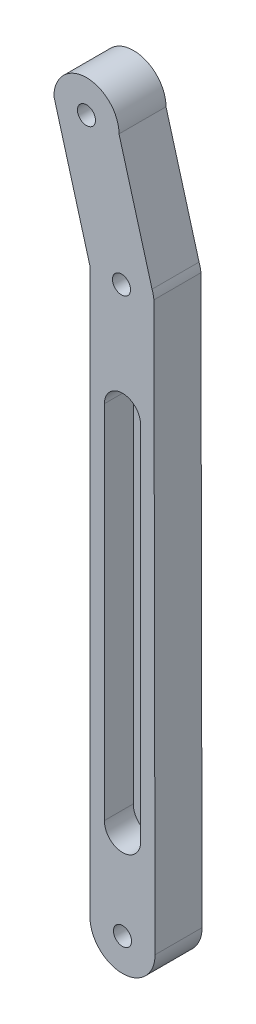
ISO-10303-21;
HEADER;
FILE_DESCRIPTION(('STEP AP214'),'2;1');
FILE_NAME('part.step','',(''),(''),'','','');
FILE_SCHEMA(('AUTOMOTIVE_DESIGN { 1 0 10303 214 1 1 1 1 }'));
ENDSEC;
DATA;
#1=APPLICATION_CONTEXT('core data for automotive mechanical design processes');
#2=APPLICATION_PROTOCOL_DEFINITION('international standard','automotive_design',2000,#1);
#3=PRODUCT_CONTEXT('',#1,'mechanical');
#4=PRODUCT('Part','Part','',(#3));
#5=PRODUCT_RELATED_PRODUCT_CATEGORY('part','',(#4));
#6=PRODUCT_DEFINITION_FORMATION('','',#4);
#7=PRODUCT_DEFINITION_CONTEXT('part definition',#1,'design');
#8=PRODUCT_DEFINITION('design','',#6,#7);
#9=PRODUCT_DEFINITION_SHAPE('','',#8);
#10=(LENGTH_UNIT() NAMED_UNIT(*) SI_UNIT(.MILLI.,.METRE.));
#11=(NAMED_UNIT(*) PLANE_ANGLE_UNIT() SI_UNIT($,.RADIAN.));
#12=(NAMED_UNIT(*) SI_UNIT($,.STERADIAN.) SOLID_ANGLE_UNIT());
#13=UNCERTAINTY_MEASURE_WITH_UNIT(LENGTH_MEASURE(1.E-05),#10,'distance_accuracy_value','');
#14=(GEOMETRIC_REPRESENTATION_CONTEXT(3) GLOBAL_UNCERTAINTY_ASSIGNED_CONTEXT((#13)) GLOBAL_UNIT_ASSIGNED_CONTEXT((#10,
#11,#12)) REPRESENTATION_CONTEXT('',''));
#15=CARTESIAN_POINT('',(0.,0.,0.));
#16=DIRECTION('',(0.,0.,1.));
#17=DIRECTION('',(1.,0.,0.));
#18=AXIS2_PLACEMENT_3D('',#15,#16,#17);
#19=CARTESIAN_POINT('',(-12.0849340363572,148.987312466072,13.));
#20=DIRECTION('',(0.,0.,1.));
#21=DIRECTION('',(1.,0.,0.));
#22=AXIS2_PLACEMENT_3D('',#19,#20,#21);
#23=PLANE('',#22);
#24=CARTESIAN_POINT('',(-2.11461561853498,82.3636914419414,13.));
#25=DIRECTION('',(0.,0.,1.));
#26=DIRECTION('',(1.,0.,0.));
#27=AXIS2_PLACEMENT_3D('',#24,#25,#26);
#28=CIRCLE('',#27,5.);
#29=CARTESIAN_POINT('',(2.88538438146502,82.3636914419414,13.));
#30=VERTEX_POINT('',#29);
#31=CARTESIAN_POINT('',(-7.11461561853498,82.3636914419414,13.));
#32=VERTEX_POINT('',#31);
#33=EDGE_CURVE('E54',#30,#32,#28,.T.);
#34=ORIENTED_EDGE('',*,*,#33,.F.);
#35=DIRECTION('',(0.000571960577738296,0.999999836430535,0.));
#36=VECTOR('',#35,1.);
#37=CARTESIAN_POINT('',(2.88538438146502,82.3636914419414,13.));
#38=LINE('',#37,#36);
#39=CARTESIAN_POINT('',(2.82861802437657,-16.8850155715431,13.));
#40=VERTEX_POINT('',#39);
#41=EDGE_CURVE('E208',#40,#30,#38,.T.);
#42=ORIENTED_EDGE('',*,*,#41,.F.);
#43=CARTESIAN_POINT('',(-2.11461561853498,-17.6363085580586,13.));
#44=DIRECTION('',(0.,0.,1.));
#45=DIRECTION('',(1.,0.,0.));
#46=AXIS2_PLACEMENT_3D('',#43,#44,#45);
#47=CIRCLE('',#46,5.);
#48=CARTESIAN_POINT('',(-7.11208071176572,-17.4771148334957,13.));
#49=VERTEX_POINT('',#48);
#50=EDGE_CURVE('E212',#49,#40,#47,.T.);
#51=ORIENTED_EDGE('',*,*,#50,.F.);
#52=DIRECTION('',(2.53894861530553E-05,-0.999999999677687,0.));
#53=VECTOR('',#52,1.);
#54=CARTESIAN_POINT('',(-7.11461561853498,82.3636914419414,13.));
#55=LINE('',#54,#53);
#56=EDGE_CURVE('E215',#32,#49,#55,.T.);
#57=ORIENTED_EDGE('',*,*,#56,.F.);
#58=EDGE_LOOP('',(#34,#42,#51,#57));
#59=FACE_BOUND('',#58,.T.);
#60=CARTESIAN_POINT('',(-2.11461561853496,-42.6363085580586,13.));
#61=DIRECTION('',(0.,0.,1.));
#62=DIRECTION('',(1.,0.,0.));
#63=AXIS2_PLACEMENT_3D('',#60,#61,#62);
#64=CIRCLE('',#63,2.5);
#65=CARTESIAN_POINT('',(-4.61461561853496,-42.6363085580586,13.));
#66=VERTEX_POINT('',#65);
#67=EDGE_CURVE('E183',#66,#66,#64,.T.);
#68=ORIENTED_EDGE('',*,*,#67,.F.);
#69=EDGE_LOOP('',(#68));
#70=FACE_BOUND('',#69,.T.);
#71=DIRECTION('',(0.268918327495868,-0.963162983682837,0.));
#72=VECTOR('',#71,1.);
#73=CARTESIAN_POINT('',(-11.114615618535,113.277430863729,13.));
#74=LINE('',#73,#72);
#75=CARTESIAN_POINT('',(-21.0849340363572,148.987312466072,13.));
#76=VERTEX_POINT('',#75);
#77=CARTESIAN_POINT('',(-11.114615618535,113.277430863729,13.));
#78=VERTEX_POINT('',#77);
#79=EDGE_CURVE('E156',#76,#78,#74,.T.);
#80=ORIENTED_EDGE('',*,*,#79,.T.);
#81=DIRECTION('',(0.,-1.,0.));
#82=VECTOR('',#81,1.);
#83=CARTESIAN_POINT('',(-11.114615618535,113.277430863729,13.));
#84=LINE('',#83,#82);
#85=CARTESIAN_POINT('',(-11.114615618535,-42.6363085580586,13.));
#86=VERTEX_POINT('',#85);
#87=EDGE_CURVE('E101',#78,#86,#84,.T.);
#88=ORIENTED_EDGE('',*,*,#87,.T.);
#89=CARTESIAN_POINT('',(-2.11461561853496,-42.6363085580586,13.));
#90=DIRECTION('',(0.,0.,1.));
#91=DIRECTION('',(1.,0.,0.));
#92=AXIS2_PLACEMENT_3D('',#89,#90,#91);
#93=CIRCLE('',#92,9.);
#94=CARTESIAN_POINT('',(6.88538438146504,-42.6363085580586,13.));
#95=VERTEX_POINT('',#94);
#96=EDGE_CURVE('E168',#86,#95,#93,.T.);
#97=ORIENTED_EDGE('',*,*,#96,.T.);
#98=DIRECTION('',(-0.00204369502849195,0.999997911653135,0.));
#99=VECTOR('',#98,1.);
#100=CARTESIAN_POINT('',(6.88538438146504,-42.6363085580586,13.));
#101=LINE('',#100,#99);
#102=CARTESIAN_POINT('',(6.56511811579736,114.072785693132,13.));
#103=VERTEX_POINT('',#102);
#104=EDGE_CURVE('E121',#95,#103,#101,.T.);
#105=ORIENTED_EDGE('',*,*,#104,.T.);
#106=CARTESIAN_POINT('',(-2.39966914856901,113.277430863729,13.));
#107=DIRECTION('',(0.,0.,1.));
#108=DIRECTION('',(1.,0.,0.));
#109=AXIS2_PLACEMENT_3D('',#106,#107,#108);
#110=CIRCLE('',#109,9.);
#111=CARTESIAN_POINT('',(6.05371091603838,116.366179070252,13.));
#112=VERTEX_POINT('',#111);
#113=EDGE_CURVE('E114',#103,#112,#110,.T.);
#114=ORIENTED_EDGE('',*,*,#113,.T.);
#115=DIRECTION('',(-0.269759329456065,0.962927777235351,0.));
#116=VECTOR('',#115,1.);
#117=CARTESIAN_POINT('',(6.05371091603838,116.366179070252,13.));
#118=LINE('',#117,#116);
#119=CARTESIAN_POINT('',(-3.08493403635723,148.987312466072,13.));
#120=VERTEX_POINT('',#119);
#121=EDGE_CURVE('E118',#112,#120,#118,.T.);
#122=ORIENTED_EDGE('',*,*,#121,.T.);
#123=CARTESIAN_POINT('',(-12.0849340363572,148.987312466072,13.));
#124=DIRECTION('',(0.,0.,1.));
#125=DIRECTION('',(1.,0.,0.));
#126=AXIS2_PLACEMENT_3D('',#123,#124,#125);
#127=CIRCLE('',#126,9.);
#128=EDGE_CURVE('E63',#120,#76,#127,.T.);
#129=ORIENTED_EDGE('',*,*,#128,.T.);
#130=EDGE_LOOP('',(#80,#88,#97,#105,#114,#122,#129));
#131=FACE_BOUND('',#130,.T.);
#132=CARTESIAN_POINT('',(-2.39966914856901,113.277430863729,13.));
#133=DIRECTION('',(0.,0.,1.));
#134=DIRECTION('',(1.,0.,0.));
#135=AXIS2_PLACEMENT_3D('',#132,#133,#134);
#136=CIRCLE('',#135,2.5);
#137=CARTESIAN_POINT('',(-4.89966914856901,113.277430863729,13.));
#138=VERTEX_POINT('',#137);
#139=EDGE_CURVE('E146',#138,#138,#136,.T.);
#140=ORIENTED_EDGE('',*,*,#139,.F.);
#141=EDGE_LOOP('',(#140));
#142=FACE_BOUND('',#141,.T.);
#143=CARTESIAN_POINT('',(-12.0849340363572,148.987312466072,13.));
#144=DIRECTION('',(0.,0.,1.));
#145=DIRECTION('',(1.,0.,0.));
#146=AXIS2_PLACEMENT_3D('',#143,#144,#145);
#147=CIRCLE('',#146,2.5);
#148=CARTESIAN_POINT('',(-14.5849340363572,148.987312466072,13.));
#149=VERTEX_POINT('',#148);
#150=EDGE_CURVE('E189',#149,#149,#147,.T.);
#151=ORIENTED_EDGE('',*,*,#150,.F.);
#152=EDGE_LOOP('',(#151));
#153=FACE_BOUND('',#152,.T.);
#154=ADVANCED_FACE('F39',(#59,#70,#131,#142,#153),#23,.T.);
#155=CARTESIAN_POINT('',(-12.0849340363572,148.987312466072,0.));
#156=DIRECTION('',(0.,0.,1.));
#157=DIRECTION('',(1.,0.,0.));
#158=AXIS2_PLACEMENT_3D('',#155,#156,#157);
#159=PLANE('',#158);
#160=CARTESIAN_POINT('',(-2.11461561853496,-42.6363085580586,0.));
#161=DIRECTION('',(0.,0.,1.));
#162=DIRECTION('',(1.,0.,0.));
#163=AXIS2_PLACEMENT_3D('',#160,#161,#162);
#164=CIRCLE('',#163,2.5);
#165=CARTESIAN_POINT('',(-4.61461561853496,-42.6363085580586,0.));
#166=VERTEX_POINT('',#165);
#167=EDGE_CURVE('E186',#166,#166,#164,.T.);
#168=ORIENTED_EDGE('',*,*,#167,.T.);
#169=EDGE_LOOP('',(#168));
#170=FACE_BOUND('',#169,.T.);
#171=DIRECTION('',(0.268918327495868,-0.963162983682837,0.));
#172=VECTOR('',#171,1.);
#173=CARTESIAN_POINT('',(-11.114615618535,113.277430863729,0.));
#174=LINE('',#173,#172);
#175=CARTESIAN_POINT('',(-21.0849340363572,148.987312466072,0.));
#176=VERTEX_POINT('',#175);
#177=CARTESIAN_POINT('',(-11.114615618535,113.277430863729,0.));
#178=VERTEX_POINT('',#177);
#179=EDGE_CURVE('E142',#176,#178,#174,.T.);
#180=ORIENTED_EDGE('',*,*,#179,.F.);
#181=CARTESIAN_POINT('',(-12.0849340363572,148.987312466072,0.));
#182=DIRECTION('',(0.,0.,1.));
#183=DIRECTION('',(1.,0.,0.));
#184=AXIS2_PLACEMENT_3D('',#181,#182,#183);
#185=CIRCLE('',#184,9.);
#186=CARTESIAN_POINT('',(-3.08493403635723,148.987312466072,0.));
#187=VERTEX_POINT('',#186);
#188=EDGE_CURVE('E93',#187,#176,#185,.T.);
#189=ORIENTED_EDGE('',*,*,#188,.F.);
#190=DIRECTION('',(-0.269759329456065,0.962927777235351,0.));
#191=VECTOR('',#190,1.);
#192=CARTESIAN_POINT('',(6.05371091603838,116.366179070252,0.));
#193=LINE('',#192,#191);
#194=CARTESIAN_POINT('',(6.05371091603838,116.366179070252,0.));
#195=VERTEX_POINT('',#194);
#196=EDGE_CURVE('E153',#195,#187,#193,.T.);
#197=ORIENTED_EDGE('',*,*,#196,.F.);
#198=CARTESIAN_POINT('',(-2.39966914856901,113.277430863729,0.));
#199=DIRECTION('',(0.,0.,1.));
#200=DIRECTION('',(1.,0.,0.));
#201=AXIS2_PLACEMENT_3D('',#198,#199,#200);
#202=CIRCLE('',#201,9.);
#203=CARTESIAN_POINT('',(6.56511811579736,114.072785693132,0.));
#204=VERTEX_POINT('',#203);
#205=EDGE_CURVE('E130',#204,#195,#202,.T.);
#206=ORIENTED_EDGE('',*,*,#205,.F.);
#207=DIRECTION('',(-0.00204369502849195,0.999997911653135,0.));
#208=VECTOR('',#207,1.);
#209=CARTESIAN_POINT('',(6.88538438146504,-42.6363085580586,0.));
#210=LINE('',#209,#208);
#211=CARTESIAN_POINT('',(6.88538438146504,-42.6363085580586,0.));
#212=VERTEX_POINT('',#211);
#213=EDGE_CURVE('E150',#212,#204,#210,.T.);
#214=ORIENTED_EDGE('',*,*,#213,.F.);
#215=CARTESIAN_POINT('',(-2.11461561853496,-42.6363085580586,0.));
#216=DIRECTION('',(0.,0.,1.));
#217=DIRECTION('',(1.,0.,0.));
#218=AXIS2_PLACEMENT_3D('',#215,#216,#217);
#219=CIRCLE('',#218,9.);
#220=CARTESIAN_POINT('',(-11.114615618535,-42.6363085580586,0.));
#221=VERTEX_POINT('',#220);
#222=EDGE_CURVE('E148',#221,#212,#219,.T.);
#223=ORIENTED_EDGE('',*,*,#222,.F.);
#224=DIRECTION('',(0.,-1.,0.));
#225=VECTOR('',#224,1.);
#226=CARTESIAN_POINT('',(-11.114615618535,113.277430863729,0.));
#227=LINE('',#226,#225);
#228=EDGE_CURVE('E145',#178,#221,#227,.T.);
#229=ORIENTED_EDGE('',*,*,#228,.F.);
#230=EDGE_LOOP('',(#180,#189,#197,#206,#214,#223,#229));
#231=FACE_BOUND('',#230,.T.);
#232=CARTESIAN_POINT('',(-2.39966914856901,113.277430863729,0.));
#233=DIRECTION('',(0.,0.,1.));
#234=DIRECTION('',(1.,0.,0.));
#235=AXIS2_PLACEMENT_3D('',#232,#233,#234);
#236=CIRCLE('',#235,2.5);
#237=CARTESIAN_POINT('',(-4.89966914856901,113.277430863729,0.));
#238=VERTEX_POINT('',#237);
#239=EDGE_CURVE('E180',#238,#238,#236,.T.);
#240=ORIENTED_EDGE('',*,*,#239,.T.);
#241=EDGE_LOOP('',(#240));
#242=FACE_BOUND('',#241,.T.);
#243=CARTESIAN_POINT('',(-12.0849340363572,148.987312466072,0.));
#244=DIRECTION('',(0.,0.,1.));
#245=DIRECTION('',(1.,0.,0.));
#246=AXIS2_PLACEMENT_3D('',#243,#244,#245);
#247=CIRCLE('',#246,2.5);
#248=CARTESIAN_POINT('',(-14.5849340363572,148.987312466072,0.));
#249=VERTEX_POINT('',#248);
#250=EDGE_CURVE('E192',#249,#249,#247,.T.);
#251=ORIENTED_EDGE('',*,*,#250,.T.);
#252=EDGE_LOOP('',(#251));
#253=FACE_BOUND('',#252,.T.);
#254=ADVANCED_FACE('F172',(#170,#231,#242,#253),#159,.F.);
#255=CARTESIAN_POINT('',(-11.114615618535,113.277430863729,13.));
#256=DIRECTION('',(0.963162983682837,0.268918327495868,0.));
#257=DIRECTION('',(-0.268918327495868,0.963162983682837,0.));
#258=AXIS2_PLACEMENT_3D('',#255,#256,#257);
#259=PLANE('',#258);
#260=ORIENTED_EDGE('',*,*,#179,.T.);
#261=DIRECTION('',(0.,0.,-1.));
#262=VECTOR('',#261,1.);
#263=CARTESIAN_POINT('',(-11.114615618535,113.277430863729,13.));
#264=LINE('',#263,#262);
#265=EDGE_CURVE('E11',#78,#178,#264,.T.);
#266=ORIENTED_EDGE('',*,*,#265,.F.);
#267=ORIENTED_EDGE('',*,*,#79,.F.);
#268=DIRECTION('',(0.,0.,-1.));
#269=VECTOR('',#268,1.);
#270=CARTESIAN_POINT('',(-21.0849340363572,148.987312466072,13.));
#271=LINE('',#270,#269);
#272=EDGE_CURVE('E138',#76,#176,#271,.T.);
#273=ORIENTED_EDGE('',*,*,#272,.T.);
#274=EDGE_LOOP('',(#260,#266,#267,#273));
#275=FACE_BOUND('',#274,.T.);
#276=ADVANCED_FACE('F41',(#275),#259,.F.);
#277=CARTESIAN_POINT('',(-11.114615618535,113.277430863729,13.));
#278=DIRECTION('',(1.,0.,0.));
#279=DIRECTION('',(0.,1.,0.));
#280=AXIS2_PLACEMENT_3D('',#277,#278,#279);
#281=PLANE('',#280);
#282=ORIENTED_EDGE('',*,*,#228,.T.);
#283=DIRECTION('',(0.,0.,-1.));
#284=VECTOR('',#283,1.);
#285=CARTESIAN_POINT('',(-11.114615618535,-42.6363085580586,13.));
#286=LINE('',#285,#284);
#287=EDGE_CURVE('E47',#86,#221,#286,.T.);
#288=ORIENTED_EDGE('',*,*,#287,.F.);
#289=ORIENTED_EDGE('',*,*,#87,.F.);
#290=ORIENTED_EDGE('',*,*,#265,.T.);
#291=EDGE_LOOP('',(#282,#288,#289,#290));
#292=FACE_BOUND('',#291,.T.);
#293=ADVANCED_FACE('F291',(#292),#281,.F.);
#294=CARTESIAN_POINT('',(-2.11461561853496,-42.6363085580586,13.));
#295=DIRECTION('',(0.,0.,-1.));
#296=DIRECTION('',(-1.,0.,0.));
#297=AXIS2_PLACEMENT_3D('',#294,#295,#296);
#298=CYLINDRICAL_SURFACE('',#297,9.);
#299=ORIENTED_EDGE('',*,*,#222,.T.);
#300=DIRECTION('',(0.,0.,-1.));
#301=VECTOR('',#300,1.);
#302=CARTESIAN_POINT('',(6.88538438146504,-42.6363085580586,13.));
#303=LINE('',#302,#301);
#304=EDGE_CURVE('E160',#95,#212,#303,.T.);
#305=ORIENTED_EDGE('',*,*,#304,.F.);
#306=ORIENTED_EDGE('',*,*,#96,.F.);
#307=ORIENTED_EDGE('',*,*,#287,.T.);
#308=EDGE_LOOP('',(#299,#305,#306,#307));
#309=FACE_BOUND('',#308,.T.);
#310=ADVANCED_FACE('F166',(#309),#298,.T.);
#311=CARTESIAN_POINT('',(6.88538438146504,-42.6363085580586,13.));
#312=DIRECTION('',(-0.999997911653135,-0.00204369502849195,0.));
#313=DIRECTION('',(0.00204369502849195,-0.999997911653135,0.));
#314=AXIS2_PLACEMENT_3D('',#311,#312,#313);
#315=PLANE('',#314);
#316=ORIENTED_EDGE('',*,*,#213,.T.);
#317=DIRECTION('',(0.,0.,-1.));
#318=VECTOR('',#317,1.);
#319=CARTESIAN_POINT('',(6.56511811579736,114.072785693132,13.));
#320=LINE('',#319,#318);
#321=EDGE_CURVE('E133',#103,#204,#320,.T.);
#322=ORIENTED_EDGE('',*,*,#321,.F.);
#323=ORIENTED_EDGE('',*,*,#104,.F.);
#324=ORIENTED_EDGE('',*,*,#304,.T.);
#325=EDGE_LOOP('',(#316,#322,#323,#324));
#326=FACE_BOUND('',#325,.T.);
#327=ADVANCED_FACE('F175',(#326),#315,.F.);
#328=CARTESIAN_POINT('',(-2.39966914856901,113.277430863729,13.));
#329=DIRECTION('',(0.,0.,-1.));
#330=DIRECTION('',(-1.,0.,0.));
#331=AXIS2_PLACEMENT_3D('',#328,#329,#330);
#332=CYLINDRICAL_SURFACE('',#331,9.);
#333=ORIENTED_EDGE('',*,*,#205,.T.);
#334=DIRECTION('',(0.,0.,-1.));
#335=VECTOR('',#334,1.);
#336=CARTESIAN_POINT('',(6.05371091603838,116.366179070252,13.));
#337=LINE('',#336,#335);
#338=EDGE_CURVE('E127',#112,#195,#337,.T.);
#339=ORIENTED_EDGE('',*,*,#338,.F.);
#340=ORIENTED_EDGE('',*,*,#113,.F.);
#341=ORIENTED_EDGE('',*,*,#321,.T.);
#342=EDGE_LOOP('',(#333,#339,#340,#341));
#343=FACE_BOUND('',#342,.T.);
#344=ADVANCED_FACE('F128',(#343),#332,.T.);
#345=CARTESIAN_POINT('',(6.05371091603838,116.366179070252,13.));
#346=DIRECTION('',(-0.962927777235351,-0.269759329456065,0.));
#347=DIRECTION('',(0.269759329456065,-0.962927777235351,0.));
#348=AXIS2_PLACEMENT_3D('',#345,#346,#347);
#349=PLANE('',#348);
#350=ORIENTED_EDGE('',*,*,#196,.T.);
#351=DIRECTION('',(0.,0.,-1.));
#352=VECTOR('',#351,1.);
#353=CARTESIAN_POINT('',(-3.08493403635723,148.987312466072,13.));
#354=LINE('',#353,#352);
#355=EDGE_CURVE('E134',#120,#187,#354,.T.);
#356=ORIENTED_EDGE('',*,*,#355,.F.);
#357=ORIENTED_EDGE('',*,*,#121,.F.);
#358=ORIENTED_EDGE('',*,*,#338,.T.);
#359=EDGE_LOOP('',(#350,#356,#357,#358));
#360=FACE_BOUND('',#359,.T.);
#361=ADVANCED_FACE('F136',(#360),#349,.F.);
#362=CARTESIAN_POINT('',(-12.0849340363572,148.987312466072,13.));
#363=DIRECTION('',(0.,0.,-1.));
#364=DIRECTION('',(-1.,0.,0.));
#365=AXIS2_PLACEMENT_3D('',#362,#363,#364);
#366=CYLINDRICAL_SURFACE('',#365,9.);
#367=ORIENTED_EDGE('',*,*,#188,.T.);
#368=ORIENTED_EDGE('',*,*,#272,.F.);
#369=ORIENTED_EDGE('',*,*,#128,.F.);
#370=ORIENTED_EDGE('',*,*,#355,.T.);
#371=EDGE_LOOP('',(#367,#368,#369,#370));
#372=FACE_BOUND('',#371,.T.);
#373=ADVANCED_FACE('F281',(#372),#366,.T.);
#374=CARTESIAN_POINT('',(-2.39966914856901,113.277430863729,13.));
#375=DIRECTION('',(0.,0.,-1.));
#376=DIRECTION('',(-1.,0.,0.));
#377=AXIS2_PLACEMENT_3D('',#374,#375,#376);
#378=CYLINDRICAL_SURFACE('',#377,2.5);
#379=CARTESIAN_POINT('',(-4.89966914856901,113.277430863729,13.));
#380=CARTESIAN_POINT('',(-4.89966914856901,113.277430863729,12.8645833333333));
#381=CARTESIAN_POINT('',(-4.89966914856901,113.277430863729,12.7291666666667));
#382=CARTESIAN_POINT('',(-4.89966914856901,113.277430863729,12.4583333333333));
#383=CARTESIAN_POINT('',(-4.89966914856901,113.277430863729,12.3229166666667));
#384=CARTESIAN_POINT('',(-4.89966914856901,113.277430863729,12.0520833333333));
#385=CARTESIAN_POINT('',(-4.89966914856901,113.277430863729,11.9166666666667));
#386=CARTESIAN_POINT('',(-4.89966914856901,113.277430863729,11.6458333333333));
#387=CARTESIAN_POINT('',(-4.89966914856901,113.277430863729,11.5104166666667));
#388=CARTESIAN_POINT('',(-4.89966914856901,113.277430863729,11.2395833333333));
#389=CARTESIAN_POINT('',(-4.89966914856901,113.277430863729,11.1041666666667));
#390=CARTESIAN_POINT('',(-4.89966914856901,113.277430863729,10.8333333333333));
#391=CARTESIAN_POINT('',(-4.89966914856901,113.277430863729,10.6979166666667));
#392=CARTESIAN_POINT('',(-4.89966914856901,113.277430863729,10.4270833333333));
#393=CARTESIAN_POINT('',(-4.89966914856901,113.277430863729,10.2916666666667));
#394=CARTESIAN_POINT('',(-4.89966914856901,113.277430863729,10.0208333333333));
#395=CARTESIAN_POINT('',(-4.89966914856901,113.277430863729,9.88541666666667));
#396=CARTESIAN_POINT('',(-4.89966914856901,113.277430863729,9.61458333333333));
#397=CARTESIAN_POINT('',(-4.89966914856901,113.277430863729,9.47916666666667));
#398=CARTESIAN_POINT('',(-4.89966914856901,113.277430863729,9.20833333333333));
#399=CARTESIAN_POINT('',(-4.89966914856901,113.277430863729,9.07291666666667));
#400=CARTESIAN_POINT('',(-4.89966914856901,113.277430863729,8.80208333333333));
#401=CARTESIAN_POINT('',(-4.89966914856901,113.277430863729,8.66666666666667));
#402=CARTESIAN_POINT('',(-4.89966914856901,113.277430863729,8.39583333333333));
#403=CARTESIAN_POINT('',(-4.89966914856901,113.277430863729,8.26041666666667));
#404=CARTESIAN_POINT('',(-4.89966914856901,113.277430863729,7.98958333333333));
#405=CARTESIAN_POINT('',(-4.89966914856901,113.277430863729,7.85416666666667));
#406=CARTESIAN_POINT('',(-4.89966914856901,113.277430863729,7.58333333333333));
#407=CARTESIAN_POINT('',(-4.89966914856901,113.277430863729,7.44791666666667));
#408=CARTESIAN_POINT('',(-4.89966914856901,113.277430863729,7.17708333333333));
#409=CARTESIAN_POINT('',(-4.89966914856901,113.277430863729,7.04166666666667));
#410=CARTESIAN_POINT('',(-4.89966914856901,113.277430863729,6.77083333333333));
#411=CARTESIAN_POINT('',(-4.89966914856901,113.277430863729,6.63541666666667));
#412=CARTESIAN_POINT('',(-4.89966914856901,113.277430863729,6.36458333333333));
#413=CARTESIAN_POINT('',(-4.89966914856901,113.277430863729,6.22916666666667));
#414=CARTESIAN_POINT('',(-4.89966914856901,113.277430863729,5.95833333333333));
#415=CARTESIAN_POINT('',(-4.89966914856901,113.277430863729,5.82291666666667));
#416=CARTESIAN_POINT('',(-4.89966914856901,113.277430863729,5.55208333333333));
#417=CARTESIAN_POINT('',(-4.89966914856901,113.277430863729,5.41666666666667));
#418=CARTESIAN_POINT('',(-4.89966914856901,113.277430863729,5.14583333333333));
#419=CARTESIAN_POINT('',(-4.89966914856901,113.277430863729,5.01041666666667));
#420=CARTESIAN_POINT('',(-4.89966914856901,113.277430863729,4.73958333333333));
#421=CARTESIAN_POINT('',(-4.89966914856901,113.277430863729,4.60416666666667));
#422=CARTESIAN_POINT('',(-4.89966914856901,113.277430863729,4.33333333333333));
#423=CARTESIAN_POINT('',(-4.89966914856901,113.277430863729,4.19791666666667));
#424=CARTESIAN_POINT('',(-4.89966914856901,113.277430863729,3.92708333333333));
#425=CARTESIAN_POINT('',(-4.89966914856901,113.277430863729,3.79166666666667));
#426=CARTESIAN_POINT('',(-4.89966914856901,113.277430863729,3.52083333333333));
#427=CARTESIAN_POINT('',(-4.89966914856901,113.277430863729,3.38541666666667));
#428=CARTESIAN_POINT('',(-4.89966914856901,113.277430863729,3.11458333333333));
#429=CARTESIAN_POINT('',(-4.89966914856901,113.277430863729,2.97916666666667));
#430=CARTESIAN_POINT('',(-4.89966914856901,113.277430863729,2.70833333333333));
#431=CARTESIAN_POINT('',(-4.89966914856901,113.277430863729,2.57291666666667));
#432=CARTESIAN_POINT('',(-4.89966914856901,113.277430863729,2.30208333333333));
#433=CARTESIAN_POINT('',(-4.89966914856901,113.277430863729,2.16666666666667));
#434=CARTESIAN_POINT('',(-4.89966914856901,113.277430863729,1.89583333333333));
#435=CARTESIAN_POINT('',(-4.89966914856901,113.277430863729,1.76041666666667));
#436=CARTESIAN_POINT('',(-4.89966914856901,113.277430863729,1.48958333333333));
#437=CARTESIAN_POINT('',(-4.89966914856901,113.277430863729,1.35416666666667));
#438=CARTESIAN_POINT('',(-4.89966914856901,113.277430863729,1.08333333333333));
#439=CARTESIAN_POINT('',(-4.89966914856901,113.277430863729,0.947916666666667));
#440=CARTESIAN_POINT('',(-4.89966914856901,113.277430863729,0.677083333333334));
#441=CARTESIAN_POINT('',(-4.89966914856901,113.277430863729,0.541666666666667));
#442=CARTESIAN_POINT('',(-4.89966914856901,113.277430863729,0.270833333333334));
#443=CARTESIAN_POINT('',(-4.89966914856901,113.277430863729,0.135416666666667));
#444=CARTESIAN_POINT('',(-4.89966914856901,113.277430863729,0.));
#445=B_SPLINE_CURVE_WITH_KNOTS('',3,(#379,#380,#381,#382,#383,#384,#385,#386,#387,#388,#389,
#390,#391,#392,#393,#394,#395,#396,#397,#398,#399,#400,#401,#402,#403,#404,#405,#406,#407,#408,
#409,#410,#411,#412,#413,#414,#415,#416,#417,#418,#419,#420,#421,#422,#423,#424,#425,#426,#427,
#428,#429,#430,#431,#432,#433,#434,#435,#436,#437,#438,#439,#440,#441,#442,#443,#444),
.UNSPECIFIED.,.F.,.F.,(4,2,2,2,2,2,2,2,2,2,2,2,2,2,2,2,2,2,2,2,2,2,2,2,2,2,2,2,2,2,2,2,4),(0.,
0.406249999999999,0.812499999999999,1.21875,1.625,2.03125,2.4375,2.84375,3.25,3.65625,4.0625,
4.46875,4.875,5.28125,5.6875,6.09375,6.5,6.90625,7.3125,7.71875,8.125,8.53125,8.9375,9.34375,
9.75,10.15625,10.5625,10.96875,11.375,11.78125,12.1875,12.59375,13.),.UNSPECIFIED.);
#446=EDGE_CURVE('BSEAM278',#138,#238,#445,.T.);
#447=ORIENTED_EDGE('',*,*,#139,.T.);
#448=ORIENTED_EDGE('',*,*,#239,.F.);
#449=ORIENTED_EDGE('',*,*,#446,.T.);
#450=ORIENTED_EDGE('',*,*,#446,.F.);
#451=EDGE_LOOP('',(#447,#449,#448,#450));
#452=FACE_BOUND('',#451,.T.);
#453=ADVANCED_FACE('F278',(#452),#378,.F.);
#454=CARTESIAN_POINT('',(-2.11461561853496,-42.6363085580586,13.));
#455=DIRECTION('',(0.,0.,-1.));
#456=DIRECTION('',(-1.,0.,0.));
#457=AXIS2_PLACEMENT_3D('',#454,#455,#456);
#458=CYLINDRICAL_SURFACE('',#457,2.5);
#459=CARTESIAN_POINT('',(-4.61461561853496,-42.6363085580586,13.));
#460=CARTESIAN_POINT('',(-4.61461561853496,-42.6363085580586,12.8645833333333));
#461=CARTESIAN_POINT('',(-4.61461561853496,-42.6363085580586,12.7291666666667));
#462=CARTESIAN_POINT('',(-4.61461561853496,-42.6363085580586,12.4583333333333));
#463=CARTESIAN_POINT('',(-4.61461561853496,-42.6363085580586,12.3229166666667));
#464=CARTESIAN_POINT('',(-4.61461561853496,-42.6363085580586,12.0520833333333));
#465=CARTESIAN_POINT('',(-4.61461561853496,-42.6363085580586,11.9166666666667));
#466=CARTESIAN_POINT('',(-4.61461561853496,-42.6363085580586,11.6458333333333));
#467=CARTESIAN_POINT('',(-4.61461561853496,-42.6363085580586,11.5104166666667));
#468=CARTESIAN_POINT('',(-4.61461561853496,-42.6363085580586,11.2395833333333));
#469=CARTESIAN_POINT('',(-4.61461561853496,-42.6363085580586,11.1041666666667));
#470=CARTESIAN_POINT('',(-4.61461561853496,-42.6363085580586,10.8333333333333));
#471=CARTESIAN_POINT('',(-4.61461561853496,-42.6363085580586,10.6979166666667));
#472=CARTESIAN_POINT('',(-4.61461561853496,-42.6363085580586,10.4270833333333));
#473=CARTESIAN_POINT('',(-4.61461561853496,-42.6363085580586,10.2916666666667));
#474=CARTESIAN_POINT('',(-4.61461561853496,-42.6363085580586,10.0208333333333));
#475=CARTESIAN_POINT('',(-4.61461561853496,-42.6363085580586,9.88541666666667));
#476=CARTESIAN_POINT('',(-4.61461561853496,-42.6363085580586,9.61458333333333));
#477=CARTESIAN_POINT('',(-4.61461561853496,-42.6363085580586,9.47916666666667));
#478=CARTESIAN_POINT('',(-4.61461561853496,-42.6363085580586,9.20833333333333));
#479=CARTESIAN_POINT('',(-4.61461561853496,-42.6363085580586,9.07291666666667));
#480=CARTESIAN_POINT('',(-4.61461561853496,-42.6363085580586,8.80208333333333));
#481=CARTESIAN_POINT('',(-4.61461561853496,-42.6363085580586,8.66666666666667));
#482=CARTESIAN_POINT('',(-4.61461561853496,-42.6363085580586,8.39583333333333));
#483=CARTESIAN_POINT('',(-4.61461561853496,-42.6363085580586,8.26041666666667));
#484=CARTESIAN_POINT('',(-4.61461561853496,-42.6363085580586,7.98958333333333));
#485=CARTESIAN_POINT('',(-4.61461561853496,-42.6363085580586,7.85416666666667));
#486=CARTESIAN_POINT('',(-4.61461561853496,-42.6363085580586,7.58333333333333));
#487=CARTESIAN_POINT('',(-4.61461561853496,-42.6363085580586,7.44791666666667));
#488=CARTESIAN_POINT('',(-4.61461561853496,-42.6363085580586,7.17708333333333));
#489=CARTESIAN_POINT('',(-4.61461561853496,-42.6363085580586,7.04166666666667));
#490=CARTESIAN_POINT('',(-4.61461561853496,-42.6363085580586,6.77083333333333));
#491=CARTESIAN_POINT('',(-4.61461561853496,-42.6363085580586,6.63541666666667));
#492=CARTESIAN_POINT('',(-4.61461561853496,-42.6363085580586,6.36458333333333));
#493=CARTESIAN_POINT('',(-4.61461561853496,-42.6363085580586,6.22916666666667));
#494=CARTESIAN_POINT('',(-4.61461561853496,-42.6363085580586,5.95833333333333));
#495=CARTESIAN_POINT('',(-4.61461561853496,-42.6363085580586,5.82291666666667));
#496=CARTESIAN_POINT('',(-4.61461561853496,-42.6363085580586,5.55208333333333));
#497=CARTESIAN_POINT('',(-4.61461561853496,-42.6363085580586,5.41666666666667));
#498=CARTESIAN_POINT('',(-4.61461561853496,-42.6363085580586,5.14583333333333));
#499=CARTESIAN_POINT('',(-4.61461561853496,-42.6363085580586,5.01041666666667));
#500=CARTESIAN_POINT('',(-4.61461561853496,-42.6363085580586,4.73958333333333));
#501=CARTESIAN_POINT('',(-4.61461561853496,-42.6363085580586,4.60416666666667));
#502=CARTESIAN_POINT('',(-4.61461561853496,-42.6363085580586,4.33333333333333));
#503=CARTESIAN_POINT('',(-4.61461561853496,-42.6363085580586,4.19791666666667));
#504=CARTESIAN_POINT('',(-4.61461561853496,-42.6363085580586,3.92708333333333));
#505=CARTESIAN_POINT('',(-4.61461561853496,-42.6363085580586,3.79166666666667));
#506=CARTESIAN_POINT('',(-4.61461561853496,-42.6363085580586,3.52083333333333));
#507=CARTESIAN_POINT('',(-4.61461561853496,-42.6363085580586,3.38541666666667));
#508=CARTESIAN_POINT('',(-4.61461561853496,-42.6363085580586,3.11458333333333));
#509=CARTESIAN_POINT('',(-4.61461561853496,-42.6363085580586,2.97916666666667));
#510=CARTESIAN_POINT('',(-4.61461561853496,-42.6363085580586,2.70833333333333));
#511=CARTESIAN_POINT('',(-4.61461561853496,-42.6363085580586,2.57291666666667));
#512=CARTESIAN_POINT('',(-4.61461561853496,-42.6363085580586,2.30208333333333));
#513=CARTESIAN_POINT('',(-4.61461561853496,-42.6363085580586,2.16666666666667));
#514=CARTESIAN_POINT('',(-4.61461561853496,-42.6363085580586,1.89583333333333));
#515=CARTESIAN_POINT('',(-4.61461561853496,-42.6363085580586,1.76041666666667));
#516=CARTESIAN_POINT('',(-4.61461561853496,-42.6363085580586,1.48958333333333));
#517=CARTESIAN_POINT('',(-4.61461561853496,-42.6363085580586,1.35416666666667));
#518=CARTESIAN_POINT('',(-4.61461561853496,-42.6363085580586,1.08333333333333));
#519=CARTESIAN_POINT('',(-4.61461561853496,-42.6363085580586,0.947916666666667));
#520=CARTESIAN_POINT('',(-4.61461561853496,-42.6363085580586,0.677083333333334));
#521=CARTESIAN_POINT('',(-4.61461561853496,-42.6363085580586,0.541666666666667));
#522=CARTESIAN_POINT('',(-4.61461561853496,-42.6363085580586,0.270833333333334));
#523=CARTESIAN_POINT('',(-4.61461561853496,-42.6363085580586,0.135416666666667));
#524=CARTESIAN_POINT('',(-4.61461561853496,-42.6363085580586,0.));
#525=B_SPLINE_CURVE_WITH_KNOTS('',3,(#459,#460,#461,#462,#463,#464,#465,#466,#467,#468,#469,
#470,#471,#472,#473,#474,#475,#476,#477,#478,#479,#480,#481,#482,#483,#484,#485,#486,#487,#488,
#489,#490,#491,#492,#493,#494,#495,#496,#497,#498,#499,#500,#501,#502,#503,#504,#505,#506,#507,
#508,#509,#510,#511,#512,#513,#514,#515,#516,#517,#518,#519,#520,#521,#522,#523,#524),
.UNSPECIFIED.,.F.,.F.,(4,2,2,2,2,2,2,2,2,2,2,2,2,2,2,2,2,2,2,2,2,2,2,2,2,2,2,2,2,2,2,2,4),(0.,
0.406249999999999,0.812499999999999,1.21875,1.625,2.03125,2.4375,2.84375,3.25,3.65625,4.0625,
4.46875,4.875,5.28125,5.6875,6.09375,6.5,6.90625,7.3125,7.71875,8.125,8.53125,8.9375,9.34375,
9.75,10.15625,10.5625,10.96875,11.375,11.78125,12.1875,12.59375,13.),.UNSPECIFIED.);
#526=EDGE_CURVE('BSEAM336',#66,#166,#525,.T.);
#527=ORIENTED_EDGE('',*,*,#67,.T.);
#528=ORIENTED_EDGE('',*,*,#167,.F.);
#529=ORIENTED_EDGE('',*,*,#526,.T.);
#530=ORIENTED_EDGE('',*,*,#526,.F.);
#531=EDGE_LOOP('',(#527,#529,#528,#530));
#532=FACE_BOUND('',#531,.T.);
#533=ADVANCED_FACE('F336',(#532),#458,.F.);
#534=CARTESIAN_POINT('',(-12.0849340363572,148.987312466072,13.));
#535=DIRECTION('',(0.,0.,-1.));
#536=DIRECTION('',(-1.,0.,0.));
#537=AXIS2_PLACEMENT_3D('',#534,#535,#536);
#538=CYLINDRICAL_SURFACE('',#537,2.5);
#539=CARTESIAN_POINT('',(-14.5849340363572,148.987312466072,13.));
#540=CARTESIAN_POINT('',(-14.5849340363572,148.987312466072,12.8645833333333));
#541=CARTESIAN_POINT('',(-14.5849340363572,148.987312466072,12.7291666666667));
#542=CARTESIAN_POINT('',(-14.5849340363572,148.987312466072,12.4583333333333));
#543=CARTESIAN_POINT('',(-14.5849340363572,148.987312466072,12.3229166666667));
#544=CARTESIAN_POINT('',(-14.5849340363572,148.987312466072,12.0520833333333));
#545=CARTESIAN_POINT('',(-14.5849340363572,148.987312466072,11.9166666666667));
#546=CARTESIAN_POINT('',(-14.5849340363572,148.987312466072,11.6458333333333));
#547=CARTESIAN_POINT('',(-14.5849340363572,148.987312466072,11.5104166666667));
#548=CARTESIAN_POINT('',(-14.5849340363572,148.987312466072,11.2395833333333));
#549=CARTESIAN_POINT('',(-14.5849340363572,148.987312466072,11.1041666666667));
#550=CARTESIAN_POINT('',(-14.5849340363572,148.987312466072,10.8333333333333));
#551=CARTESIAN_POINT('',(-14.5849340363572,148.987312466072,10.6979166666667));
#552=CARTESIAN_POINT('',(-14.5849340363572,148.987312466072,10.4270833333333));
#553=CARTESIAN_POINT('',(-14.5849340363572,148.987312466072,10.2916666666667));
#554=CARTESIAN_POINT('',(-14.5849340363572,148.987312466072,10.0208333333333));
#555=CARTESIAN_POINT('',(-14.5849340363572,148.987312466072,9.88541666666667));
#556=CARTESIAN_POINT('',(-14.5849340363572,148.987312466072,9.61458333333333));
#557=CARTESIAN_POINT('',(-14.5849340363572,148.987312466072,9.47916666666667));
#558=CARTESIAN_POINT('',(-14.5849340363572,148.987312466072,9.20833333333333));
#559=CARTESIAN_POINT('',(-14.5849340363572,148.987312466072,9.07291666666667));
#560=CARTESIAN_POINT('',(-14.5849340363572,148.987312466072,8.80208333333333));
#561=CARTESIAN_POINT('',(-14.5849340363572,148.987312466072,8.66666666666667));
#562=CARTESIAN_POINT('',(-14.5849340363572,148.987312466072,8.39583333333333));
#563=CARTESIAN_POINT('',(-14.5849340363572,148.987312466072,8.26041666666667));
#564=CARTESIAN_POINT('',(-14.5849340363572,148.987312466072,7.98958333333333));
#565=CARTESIAN_POINT('',(-14.5849340363572,148.987312466072,7.85416666666667));
#566=CARTESIAN_POINT('',(-14.5849340363572,148.987312466072,7.58333333333333));
#567=CARTESIAN_POINT('',(-14.5849340363572,148.987312466072,7.44791666666667));
#568=CARTESIAN_POINT('',(-14.5849340363572,148.987312466072,7.17708333333333));
#569=CARTESIAN_POINT('',(-14.5849340363572,148.987312466072,7.04166666666667));
#570=CARTESIAN_POINT('',(-14.5849340363572,148.987312466072,6.77083333333333));
#571=CARTESIAN_POINT('',(-14.5849340363572,148.987312466072,6.63541666666667));
#572=CARTESIAN_POINT('',(-14.5849340363572,148.987312466072,6.36458333333333));
#573=CARTESIAN_POINT('',(-14.5849340363572,148.987312466072,6.22916666666667));
#574=CARTESIAN_POINT('',(-14.5849340363572,148.987312466072,5.95833333333333));
#575=CARTESIAN_POINT('',(-14.5849340363572,148.987312466072,5.82291666666667));
#576=CARTESIAN_POINT('',(-14.5849340363572,148.987312466072,5.55208333333333));
#577=CARTESIAN_POINT('',(-14.5849340363572,148.987312466072,5.41666666666667));
#578=CARTESIAN_POINT('',(-14.5849340363572,148.987312466072,5.14583333333333));
#579=CARTESIAN_POINT('',(-14.5849340363572,148.987312466072,5.01041666666667));
#580=CARTESIAN_POINT('',(-14.5849340363572,148.987312466072,4.73958333333333));
#581=CARTESIAN_POINT('',(-14.5849340363572,148.987312466072,4.60416666666667));
#582=CARTESIAN_POINT('',(-14.5849340363572,148.987312466072,4.33333333333333));
#583=CARTESIAN_POINT('',(-14.5849340363572,148.987312466072,4.19791666666667));
#584=CARTESIAN_POINT('',(-14.5849340363572,148.987312466072,3.92708333333333));
#585=CARTESIAN_POINT('',(-14.5849340363572,148.987312466072,3.79166666666667));
#586=CARTESIAN_POINT('',(-14.5849340363572,148.987312466072,3.52083333333333));
#587=CARTESIAN_POINT('',(-14.5849340363572,148.987312466072,3.38541666666667));
#588=CARTESIAN_POINT('',(-14.5849340363572,148.987312466072,3.11458333333333));
#589=CARTESIAN_POINT('',(-14.5849340363572,148.987312466072,2.97916666666667));
#590=CARTESIAN_POINT('',(-14.5849340363572,148.987312466072,2.70833333333333));
#591=CARTESIAN_POINT('',(-14.5849340363572,148.987312466072,2.57291666666667));
#592=CARTESIAN_POINT('',(-14.5849340363572,148.987312466072,2.30208333333333));
#593=CARTESIAN_POINT('',(-14.5849340363572,148.987312466072,2.16666666666667));
#594=CARTESIAN_POINT('',(-14.5849340363572,148.987312466072,1.89583333333333));
#595=CARTESIAN_POINT('',(-14.5849340363572,148.987312466072,1.76041666666667));
#596=CARTESIAN_POINT('',(-14.5849340363572,148.987312466072,1.48958333333333));
#597=CARTESIAN_POINT('',(-14.5849340363572,148.987312466072,1.35416666666667));
#598=CARTESIAN_POINT('',(-14.5849340363572,148.987312466072,1.08333333333333));
#599=CARTESIAN_POINT('',(-14.5849340363572,148.987312466072,0.947916666666667));
#600=CARTESIAN_POINT('',(-14.5849340363572,148.987312466072,0.677083333333334));
#601=CARTESIAN_POINT('',(-14.5849340363572,148.987312466072,0.541666666666667));
#602=CARTESIAN_POINT('',(-14.5849340363572,148.987312466072,0.270833333333334));
#603=CARTESIAN_POINT('',(-14.5849340363572,148.987312466072,0.135416666666667));
#604=CARTESIAN_POINT('',(-14.5849340363572,148.987312466072,0.));
#605=B_SPLINE_CURVE_WITH_KNOTS('',3,(#539,#540,#541,#542,#543,#544,#545,#546,#547,#548,#549,
#550,#551,#552,#553,#554,#555,#556,#557,#558,#559,#560,#561,#562,#563,#564,#565,#566,#567,#568,
#569,#570,#571,#572,#573,#574,#575,#576,#577,#578,#579,#580,#581,#582,#583,#584,#585,#586,#587,
#588,#589,#590,#591,#592,#593,#594,#595,#596,#597,#598,#599,#600,#601,#602,#603,#604),
.UNSPECIFIED.,.F.,.F.,(4,2,2,2,2,2,2,2,2,2,2,2,2,2,2,2,2,2,2,2,2,2,2,2,2,2,2,2,2,2,2,2,4),(0.,
0.406249999999999,0.812499999999999,1.21875,1.625,2.03125,2.4375,2.84375,3.25,3.65625,4.0625,
4.46875,4.875,5.28125,5.6875,6.09375,6.5,6.90625,7.3125,7.71875,8.125,8.53125,8.9375,9.34375,
9.75,10.15625,10.5625,10.96875,11.375,11.78125,12.1875,12.59375,13.),.UNSPECIFIED.);
#606=EDGE_CURVE('BSEAM343',#149,#249,#605,.T.);
#607=ORIENTED_EDGE('',*,*,#150,.T.);
#608=ORIENTED_EDGE('',*,*,#250,.F.);
#609=ORIENTED_EDGE('',*,*,#606,.T.);
#610=ORIENTED_EDGE('',*,*,#606,.F.);
#611=EDGE_LOOP('',(#607,#609,#608,#610));
#612=FACE_BOUND('',#611,.T.);
#613=ADVANCED_FACE('F343',(#612),#538,.F.);
#614=CARTESIAN_POINT('',(-2.11461561853498,82.3636914419414,5.));
#615=DIRECTION('',(0.,0.,1.));
#616=DIRECTION('',(1.,0.,0.));
#617=AXIS2_PLACEMENT_3D('',#614,#615,#616);
#618=CYLINDRICAL_SURFACE('',#617,5.);
#619=ORIENTED_EDGE('',*,*,#33,.T.);
#620=DIRECTION('',(0.,0.,1.));
#621=VECTOR('',#620,1.);
#622=CARTESIAN_POINT('',(-7.11461561853498,82.3636914419414,5.));
#623=LINE('',#622,#621);
#624=CARTESIAN_POINT('',(-7.11461561853498,82.3636914419414,5.));
#625=VERTEX_POINT('',#624);
#626=EDGE_CURVE('E198',#625,#32,#623,.T.);
#627=ORIENTED_EDGE('',*,*,#626,.F.);
#628=CARTESIAN_POINT('',(-2.11461561853498,82.3636914419414,5.));
#629=DIRECTION('',(0.,0.,1.));
#630=DIRECTION('',(1.,0.,0.));
#631=AXIS2_PLACEMENT_3D('',#628,#629,#630);
#632=CIRCLE('',#631,5.);
#633=CARTESIAN_POINT('',(2.88538438146502,82.3636914419414,5.));
#634=VERTEX_POINT('',#633);
#635=EDGE_CURVE('E211',#634,#625,#632,.T.);
#636=ORIENTED_EDGE('',*,*,#635,.F.);
#637=DIRECTION('',(0.,0.,1.));
#638=VECTOR('',#637,1.);
#639=CARTESIAN_POINT('',(2.88538438146502,82.3636914419414,5.));
#640=LINE('',#639,#638);
#641=EDGE_CURVE('E195',#634,#30,#640,.T.);
#642=ORIENTED_EDGE('',*,*,#641,.T.);
#643=EDGE_LOOP('',(#619,#627,#636,#642));
#644=FACE_BOUND('',#643,.T.);
#645=ADVANCED_FACE('F236',(#644),#618,.F.);
#646=CARTESIAN_POINT('',(2.88538438146502,82.3636914419414,5.));
#647=DIRECTION('',(0.999999836430535,-0.000571960577738296,0.));
#648=DIRECTION('',(0.000571960577738296,0.999999836430535,0.));
#649=AXIS2_PLACEMENT_3D('',#646,#647,#648);
#650=PLANE('',#649);
#651=ORIENTED_EDGE('',*,*,#41,.T.);
#652=ORIENTED_EDGE('',*,*,#641,.F.);
#653=DIRECTION('',(0.000571960577738296,0.999999836430535,0.));
#654=VECTOR('',#653,1.);
#655=CARTESIAN_POINT('',(2.88538438146502,82.3636914419414,5.));
#656=LINE('',#655,#654);
#657=CARTESIAN_POINT('',(2.82861802437657,-16.8850155715431,5.));
#658=VERTEX_POINT('',#657);
#659=EDGE_CURVE('E201',#658,#634,#656,.T.);
#660=ORIENTED_EDGE('',*,*,#659,.F.);
#661=DIRECTION('',(0.,0.,1.));
#662=VECTOR('',#661,1.);
#663=CARTESIAN_POINT('',(2.82861802437657,-16.8850155715431,5.));
#664=LINE('',#663,#662);
#665=EDGE_CURVE('E204',#658,#40,#664,.T.);
#666=ORIENTED_EDGE('',*,*,#665,.T.);
#667=EDGE_LOOP('',(#651,#652,#660,#666));
#668=FACE_BOUND('',#667,.T.);
#669=ADVANCED_FACE('F247',(#668),#650,.F.);
#670=CARTESIAN_POINT('',(-2.11461561853498,-17.6363085580586,5.));
#671=DIRECTION('',(0.,0.,1.));
#672=DIRECTION('',(1.,0.,0.));
#673=AXIS2_PLACEMENT_3D('',#670,#671,#672);
#674=CYLINDRICAL_SURFACE('',#673,5.);
#675=ORIENTED_EDGE('',*,*,#50,.T.);
#676=ORIENTED_EDGE('',*,*,#665,.F.);
#677=CARTESIAN_POINT('',(-2.11461561853498,-17.6363085580586,5.));
#678=DIRECTION('',(0.,0.,1.));
#679=DIRECTION('',(1.,0.,0.));
#680=AXIS2_PLACEMENT_3D('',#677,#678,#679);
#681=CIRCLE('',#680,5.);
#682=CARTESIAN_POINT('',(-7.11208071176572,-17.4771148334957,5.));
#683=VERTEX_POINT('',#682);
#684=EDGE_CURVE('E221',#683,#658,#681,.T.);
#685=ORIENTED_EDGE('',*,*,#684,.F.);
#686=DIRECTION('',(0.,0.,1.));
#687=VECTOR('',#686,1.);
#688=CARTESIAN_POINT('',(-7.11208071176572,-17.4771148334957,5.));
#689=LINE('',#688,#687);
#690=EDGE_CURVE('E200',#683,#49,#689,.T.);
#691=ORIENTED_EDGE('',*,*,#690,.T.);
#692=EDGE_LOOP('',(#675,#676,#685,#691));
#693=FACE_BOUND('',#692,.T.);
#694=ADVANCED_FACE('F252',(#693),#674,.F.);
#695=CARTESIAN_POINT('',(-7.11461561853498,82.3636914419414,5.));
#696=DIRECTION('',(-0.999999999677687,-2.53894861530553E-05,0.));
#697=DIRECTION('',(2.53894861530553E-05,-0.999999999677687,0.));
#698=AXIS2_PLACEMENT_3D('',#695,#696,#697);
#699=PLANE('',#698);
#700=ORIENTED_EDGE('',*,*,#56,.T.);
#701=ORIENTED_EDGE('',*,*,#690,.F.);
#702=DIRECTION('',(2.53894861530553E-05,-0.999999999677687,0.));
#703=VECTOR('',#702,1.);
#704=CARTESIAN_POINT('',(-7.11461561853498,82.3636914419414,5.));
#705=LINE('',#704,#703);
#706=EDGE_CURVE('E224',#625,#683,#705,.T.);
#707=ORIENTED_EDGE('',*,*,#706,.F.);
#708=ORIENTED_EDGE('',*,*,#626,.T.);
#709=EDGE_LOOP('',(#700,#701,#707,#708));
#710=FACE_BOUND('',#709,.T.);
#711=ADVANCED_FACE('F258',(#710),#699,.F.);
#712=CARTESIAN_POINT('',(-2.11461561853498,82.3636914419414,5.));
#713=DIRECTION('',(0.,0.,1.));
#714=DIRECTION('',(1.,0.,0.));
#715=AXIS2_PLACEMENT_3D('',#712,#713,#714);
#716=PLANE('',#715);
#717=ORIENTED_EDGE('',*,*,#635,.T.);
#718=ORIENTED_EDGE('',*,*,#706,.T.);
#719=ORIENTED_EDGE('',*,*,#684,.T.);
#720=ORIENTED_EDGE('',*,*,#659,.T.);
#721=EDGE_LOOP('',(#717,#718,#719,#720));
#722=FACE_BOUND('',#721,.T.);
#723=ADVANCED_FACE('F231',(#722),#716,.T.);
#724=CLOSED_SHELL('',(#154,#254,#276,#293,#310,#327,#344,#361,#373,#453,#533,#613,#645,#669,
#694,#711,#723));
#725=MANIFOLD_SOLID_BREP('B2',#724);
#726=ADVANCED_BREP_SHAPE_REPRESENTATION('',(#18,#725),#14);
#727=SHAPE_DEFINITION_REPRESENTATION(#9,#726);
ENDSEC;
END-ISO-10303-21;
